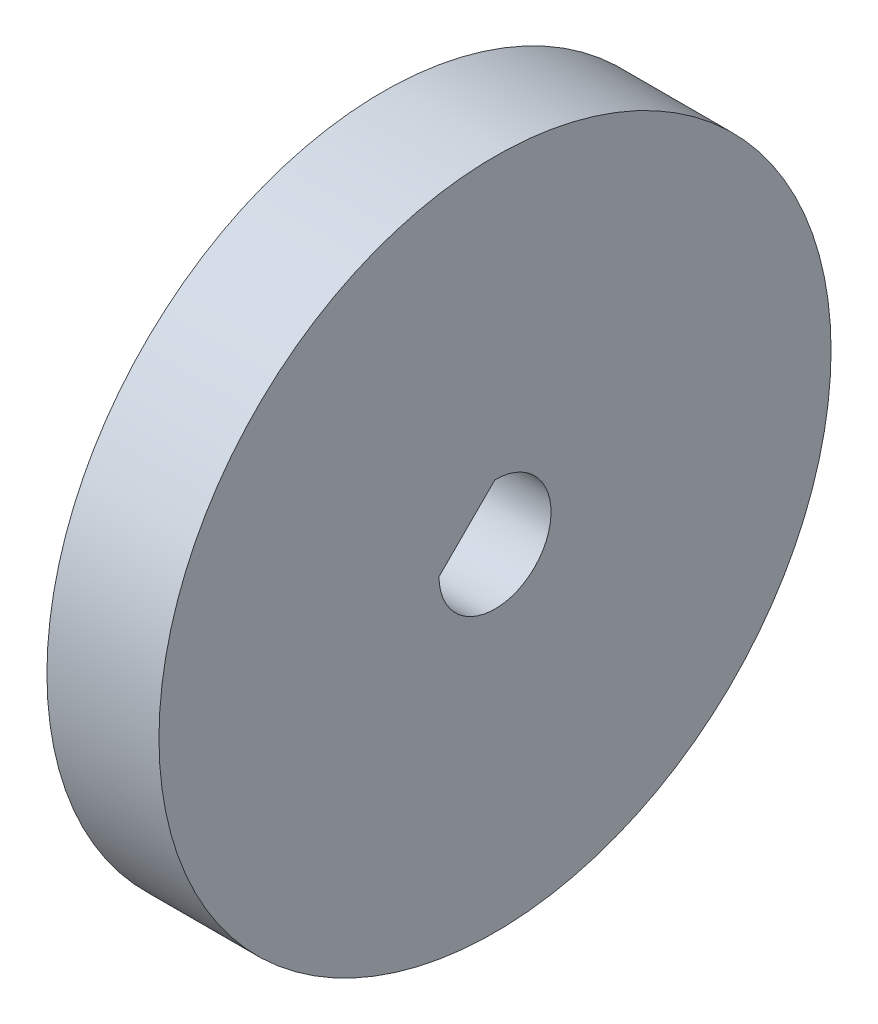
ISO-10303-21;
HEADER;
FILE_DESCRIPTION(('STEP AP214'),'2;1');
FILE_NAME('part.step','',(''),(''),'','','');
FILE_SCHEMA(('AUTOMOTIVE_DESIGN { 1 0 10303 214 1 1 1 1 }'));
ENDSEC;
DATA;
#1=APPLICATION_CONTEXT('core data for automotive mechanical design processes');
#2=APPLICATION_PROTOCOL_DEFINITION('international standard','automotive_design',2000,#1);
#3=PRODUCT_CONTEXT('',#1,'mechanical');
#4=PRODUCT('Part','Part','',(#3));
#5=PRODUCT_RELATED_PRODUCT_CATEGORY('part','',(#4));
#6=PRODUCT_DEFINITION_FORMATION('','',#4);
#7=PRODUCT_DEFINITION_CONTEXT('part definition',#1,'design');
#8=PRODUCT_DEFINITION('design','',#6,#7);
#9=PRODUCT_DEFINITION_SHAPE('','',#8);
#10=(LENGTH_UNIT() NAMED_UNIT(*) SI_UNIT(.MILLI.,.METRE.));
#11=(NAMED_UNIT(*) PLANE_ANGLE_UNIT() SI_UNIT($,.RADIAN.));
#12=(NAMED_UNIT(*) SI_UNIT($,.STERADIAN.) SOLID_ANGLE_UNIT());
#13=UNCERTAINTY_MEASURE_WITH_UNIT(LENGTH_MEASURE(1.E-05),#10,'distance_accuracy_value','');
#14=(GEOMETRIC_REPRESENTATION_CONTEXT(3) GLOBAL_UNCERTAINTY_ASSIGNED_CONTEXT((#13)) GLOBAL_UNIT_ASSIGNED_CONTEXT((#10,
#11,#12)) REPRESENTATION_CONTEXT('',''));
#15=CARTESIAN_POINT('',(0.,0.,0.));
#16=DIRECTION('',(0.,0.,1.));
#17=DIRECTION('',(1.,0.,0.));
#18=AXIS2_PLACEMENT_3D('',#15,#16,#17);
#19=CARTESIAN_POINT('',(6.35,0.,0.));
#20=DIRECTION('',(-1.,0.,0.));
#21=DIRECTION('',(0.,0.,1.));
#22=AXIS2_PLACEMENT_3D('',#19,#20,#21);
#23=CYLINDRICAL_SURFACE('',#22,19.05);
#24=CARTESIAN_POINT('',(6.35,0.,0.));
#25=DIRECTION('',(1.,0.,0.));
#26=DIRECTION('',(0.,0.,-1.));
#27=AXIS2_PLACEMENT_3D('',#24,#25,#26);
#28=CIRCLE('',#27,19.05);
#29=CARTESIAN_POINT('',(6.35,0.,-19.05));
#30=VERTEX_POINT('',#29);
#31=EDGE_CURVE('E11',#30,#30,#28,.T.);
#32=ORIENTED_EDGE('',*,*,#31,.F.);
#33=EDGE_LOOP('',(#32));
#34=FACE_BOUND('',#33,.T.);
#35=CARTESIAN_POINT('',(0.,0.,0.));
#36=DIRECTION('',(1.,0.,0.));
#37=DIRECTION('',(0.,0.,-1.));
#38=AXIS2_PLACEMENT_3D('',#35,#36,#37);
#39=CIRCLE('',#38,19.05);
#40=CARTESIAN_POINT('',(0.,0.,-19.05));
#41=VERTEX_POINT('',#40);
#42=EDGE_CURVE('E39',#41,#41,#39,.T.);
#43=ORIENTED_EDGE('',*,*,#42,.T.);
#44=EDGE_LOOP('',(#43));
#45=FACE_BOUND('',#44,.T.);
#46=ADVANCED_FACE('F36',(#34,#45),#23,.T.);
#47=CARTESIAN_POINT('',(6.35,0.,0.));
#48=DIRECTION('',(1.,0.,0.));
#49=DIRECTION('',(0.,0.,-1.));
#50=AXIS2_PLACEMENT_3D('',#47,#48,#49);
#51=PLANE('',#50);
#52=CARTESIAN_POINT('',(6.35,0.,0.));
#53=DIRECTION('',(1.,0.,0.));
#54=DIRECTION('',(0.,0.,-1.));
#55=AXIS2_PLACEMENT_3D('',#52,#53,#54);
#56=CIRCLE('',#55,3.175);
#57=CARTESIAN_POINT('',(6.35,3.175,0.));
#58=VERTEX_POINT('',#57);
#59=CARTESIAN_POINT('',(6.35,0.,3.175));
#60=VERTEX_POINT('',#59);
#61=EDGE_CURVE('E71',#58,#60,#56,.F.);
#62=ORIENTED_EDGE('',*,*,#61,.T.);
#63=DIRECTION('',(0.,0.707106781186548,-0.707106781186548));
#64=VECTOR('',#63,1.);
#65=CARTESIAN_POINT('',(6.35,3.175,0.));
#66=LINE('',#65,#64);
#67=EDGE_CURVE('E63',#60,#58,#66,.T.);
#68=ORIENTED_EDGE('',*,*,#67,.T.);
#69=EDGE_LOOP('',(#62,#68));
#70=FACE_BOUND('',#69,.T.);
#71=ORIENTED_EDGE('',*,*,#31,.T.);
#72=EDGE_LOOP('',(#71));
#73=FACE_BOUND('',#72,.T.);
#74=ADVANCED_FACE('F74',(#70,#73),#51,.T.);
#75=CARTESIAN_POINT('',(0.,0.,0.));
#76=DIRECTION('',(1.,0.,0.));
#77=DIRECTION('',(0.,0.,-1.));
#78=AXIS2_PLACEMENT_3D('',#75,#76,#77);
#79=PLANE('',#78);
#80=DIRECTION('',(0.,0.707106781186547,-0.707106781186547));
#81=VECTOR('',#80,1.);
#82=CARTESIAN_POINT('',(0.,3.175,0.));
#83=LINE('',#82,#81);
#84=CARTESIAN_POINT('',(0.,0.,3.175));
#85=VERTEX_POINT('',#84);
#86=CARTESIAN_POINT('',(0.,3.175,0.));
#87=VERTEX_POINT('',#86);
#88=EDGE_CURVE('E72',#85,#87,#83,.T.);
#89=ORIENTED_EDGE('',*,*,#88,.F.);
#90=CARTESIAN_POINT('',(0.,0.,0.));
#91=DIRECTION('',(-1.,0.,0.));
#92=DIRECTION('',(0.,0.,1.));
#93=AXIS2_PLACEMENT_3D('',#90,#91,#92);
#94=CIRCLE('',#93,3.175);
#95=EDGE_CURVE('E57',#87,#85,#94,.T.);
#96=ORIENTED_EDGE('',*,*,#95,.F.);
#97=EDGE_LOOP('',(#89,#96));
#98=FACE_BOUND('',#97,.T.);
#99=ORIENTED_EDGE('',*,*,#42,.F.);
#100=EDGE_LOOP('',(#99));
#101=FACE_BOUND('',#100,.T.);
#102=ADVANCED_FACE('F81',(#98,#101),#79,.F.);
#103=CARTESIAN_POINT('',(6.351,0.,0.));
#104=DIRECTION('',(-1.,0.,0.));
#105=DIRECTION('',(0.,0.,1.));
#106=AXIS2_PLACEMENT_3D('',#103,#104,#105);
#107=CYLINDRICAL_SURFACE('',#106,3.175);
#108=DIRECTION('',(-1.,0.,0.));
#109=VECTOR('',#108,1.);
#110=CARTESIAN_POINT('',(6.351,3.175,0.));
#111=LINE('',#110,#109);
#112=EDGE_CURVE('E50',#58,#87,#111,.T.);
#113=ORIENTED_EDGE('',*,*,#112,.T.);
#114=ORIENTED_EDGE('',*,*,#95,.T.);
#115=DIRECTION('',(-1.,0.,0.));
#116=VECTOR('',#115,1.);
#117=CARTESIAN_POINT('',(6.351,0.,3.175));
#118=LINE('',#117,#116);
#119=EDGE_CURVE('E65',#60,#85,#118,.T.);
#120=ORIENTED_EDGE('',*,*,#119,.F.);
#121=ORIENTED_EDGE('',*,*,#61,.F.);
#122=EDGE_LOOP('',(#113,#114,#120,#121));
#123=FACE_BOUND('',#122,.T.);
#124=ADVANCED_FACE('F70',(#123),#107,.F.);
#125=CARTESIAN_POINT('',(6.351,3.175,0.));
#126=DIRECTION('',(0.,0.707106781186548,0.707106781186548));
#127=DIRECTION('',(0.,-0.707106781186548,0.707106781186548));
#128=AXIS2_PLACEMENT_3D('',#125,#126,#127);
#129=PLANE('',#128);
#130=ORIENTED_EDGE('',*,*,#119,.T.);
#131=ORIENTED_EDGE('',*,*,#88,.T.);
#132=ORIENTED_EDGE('',*,*,#112,.F.);
#133=ORIENTED_EDGE('',*,*,#67,.F.);
#134=EDGE_LOOP('',(#130,#131,#132,#133));
#135=FACE_BOUND('',#134,.T.);
#136=ADVANCED_FACE('F64',(#135),#129,.F.);
#137=CLOSED_SHELL('',(#46,#74,#102,#124,#136));
#138=MANIFOLD_SOLID_BREP('B2',#137);
#139=ADVANCED_BREP_SHAPE_REPRESENTATION('',(#18,#138),#14);
#140=SHAPE_DEFINITION_REPRESENTATION(#9,#139);
ENDSEC;
END-ISO-10303-21;
